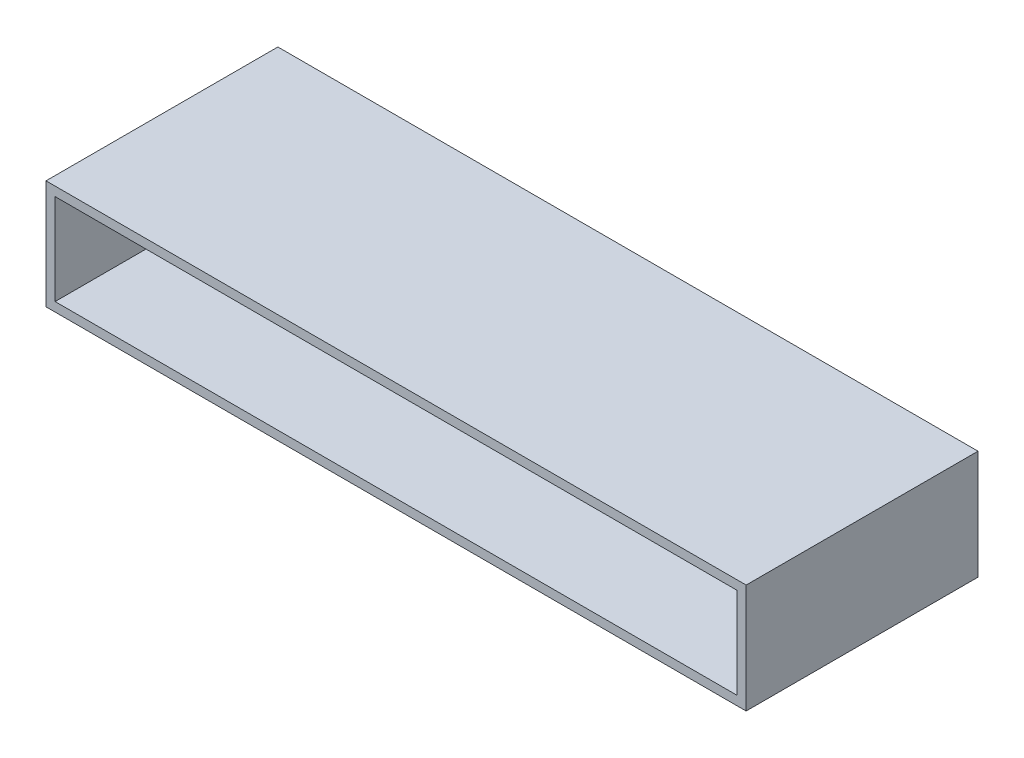
ISO-10303-21;
HEADER;
FILE_DESCRIPTION(('STEP AP214'),'2;1');
FILE_NAME('part.step','',(''),(''),'','','');
FILE_SCHEMA(('AUTOMOTIVE_DESIGN { 1 0 10303 214 1 1 1 1 }'));
ENDSEC;
DATA;
#1=APPLICATION_CONTEXT('core data for automotive mechanical design processes');
#2=APPLICATION_PROTOCOL_DEFINITION('international standard','automotive_design',2000,#1);
#3=PRODUCT_CONTEXT('',#1,'mechanical');
#4=PRODUCT('Part','Part','',(#3));
#5=PRODUCT_RELATED_PRODUCT_CATEGORY('part','',(#4));
#6=PRODUCT_DEFINITION_FORMATION('','',#4);
#7=PRODUCT_DEFINITION_CONTEXT('part definition',#1,'design');
#8=PRODUCT_DEFINITION('design','',#6,#7);
#9=PRODUCT_DEFINITION_SHAPE('','',#8);
#10=(LENGTH_UNIT() NAMED_UNIT(*) SI_UNIT(.MILLI.,.METRE.));
#11=(NAMED_UNIT(*) PLANE_ANGLE_UNIT() SI_UNIT($,.RADIAN.));
#12=(NAMED_UNIT(*) SI_UNIT($,.STERADIAN.) SOLID_ANGLE_UNIT());
#13=UNCERTAINTY_MEASURE_WITH_UNIT(LENGTH_MEASURE(1.E-05),#10,'distance_accuracy_value','');
#14=(GEOMETRIC_REPRESENTATION_CONTEXT(3) GLOBAL_UNCERTAINTY_ASSIGNED_CONTEXT((#13)) GLOBAL_UNIT_ASSIGNED_CONTEXT((#10,
#11,#12)) REPRESENTATION_CONTEXT('',''));
#15=CARTESIAN_POINT('',(0.,0.,0.));
#16=DIRECTION('',(0.,0.,1.));
#17=DIRECTION('',(1.,0.,0.));
#18=AXIS2_PLACEMENT_3D('',#15,#16,#17);
#19=CARTESIAN_POINT('',(0.,0.,51.));
#20=DIRECTION('',(0.,0.,-1.));
#21=DIRECTION('',(-1.,0.,0.));
#22=AXIS2_PLACEMENT_3D('',#19,#20,#21);
#23=PLANE('',#22);
#24=DIRECTION('',(0.,-1.,0.));
#25=VECTOR('',#24,1.);
#26=CARTESIAN_POINT('',(0.,0.,51.));
#27=LINE('',#26,#25);
#28=CARTESIAN_POINT('',(0.,24.,51.));
#29=VERTEX_POINT('',#28);
#30=CARTESIAN_POINT('',(0.,0.,51.));
#31=VERTEX_POINT('',#30);
#32=EDGE_CURVE('E144',#29,#31,#27,.T.);
#33=ORIENTED_EDGE('',*,*,#32,.T.);
#34=DIRECTION('',(1.,0.,0.));
#35=VECTOR('',#34,1.);
#36=CARTESIAN_POINT('',(0.,0.,51.));
#37=LINE('',#36,#35);
#38=CARTESIAN_POINT('',(154.,0.,51.));
#39=VERTEX_POINT('',#38);
#40=EDGE_CURVE('E146',#31,#39,#37,.T.);
#41=ORIENTED_EDGE('',*,*,#40,.T.);
#42=DIRECTION('',(0.,1.,0.));
#43=VECTOR('',#42,1.);
#44=CARTESIAN_POINT('',(154.,0.,51.));
#45=LINE('',#44,#43);
#46=CARTESIAN_POINT('',(154.,24.,51.));
#47=VERTEX_POINT('',#46);
#48=EDGE_CURVE('E151',#39,#47,#45,.T.);
#49=ORIENTED_EDGE('',*,*,#48,.T.);
#50=DIRECTION('',(-1.,0.,0.));
#51=VECTOR('',#50,1.);
#52=CARTESIAN_POINT('',(0.,24.,51.));
#53=LINE('',#52,#51);
#54=EDGE_CURVE('E153',#47,#29,#53,.T.);
#55=ORIENTED_EDGE('',*,*,#54,.T.);
#56=EDGE_LOOP('',(#33,#41,#49,#55));
#57=FACE_BOUND('',#56,.T.);
#58=DIRECTION('',(0.,-1.,0.));
#59=VECTOR('',#58,1.);
#60=CARTESIAN_POINT('',(2.,2.,51.));
#61=LINE('',#60,#59);
#62=CARTESIAN_POINT('',(2.,22.,51.));
#63=VERTEX_POINT('',#62);
#64=CARTESIAN_POINT('',(2.,2.,51.));
#65=VERTEX_POINT('',#64);
#66=EDGE_CURVE('E126',#63,#65,#61,.T.);
#67=ORIENTED_EDGE('',*,*,#66,.F.);
#68=DIRECTION('',(-1.,0.,0.));
#69=VECTOR('',#68,1.);
#70=CARTESIAN_POINT('',(2.,22.,51.));
#71=LINE('',#70,#69);
#72=CARTESIAN_POINT('',(152.,22.,51.));
#73=VERTEX_POINT('',#72);
#74=EDGE_CURVE('E117',#73,#63,#71,.T.);
#75=ORIENTED_EDGE('',*,*,#74,.F.);
#76=DIRECTION('',(0.,1.,0.));
#77=VECTOR('',#76,1.);
#78=CARTESIAN_POINT('',(152.,2.,51.));
#79=LINE('',#78,#77);
#80=CARTESIAN_POINT('',(152.,2.,51.));
#81=VERTEX_POINT('',#80);
#82=EDGE_CURVE('E137',#81,#73,#79,.T.);
#83=ORIENTED_EDGE('',*,*,#82,.F.);
#84=DIRECTION('',(1.,0.,0.));
#85=VECTOR('',#84,1.);
#86=CARTESIAN_POINT('',(2.,2.,51.));
#87=LINE('',#86,#85);
#88=EDGE_CURVE('E128',#65,#81,#87,.T.);
#89=ORIENTED_EDGE('',*,*,#88,.F.);
#90=EDGE_LOOP('',(#67,#75,#83,#89));
#91=FACE_BOUND('',#90,.T.);
#92=ADVANCED_FACE('F43',(#57,#91),#23,.F.);
#93=CARTESIAN_POINT('',(0.,0.,0.));
#94=DIRECTION('',(0.,0.,-1.));
#95=DIRECTION('',(-1.,0.,0.));
#96=AXIS2_PLACEMENT_3D('',#93,#94,#95);
#97=PLANE('',#96);
#98=DIRECTION('',(0.,-1.,0.));
#99=VECTOR('',#98,1.);
#100=CARTESIAN_POINT('',(0.,0.,0.));
#101=LINE('',#100,#99);
#102=CARTESIAN_POINT('',(0.,24.,0.));
#103=VERTEX_POINT('',#102);
#104=CARTESIAN_POINT('',(0.,0.,0.));
#105=VERTEX_POINT('',#104);
#106=EDGE_CURVE('E145',#103,#105,#101,.T.);
#107=ORIENTED_EDGE('',*,*,#106,.F.);
#108=DIRECTION('',(-1.,0.,0.));
#109=VECTOR('',#108,1.);
#110=CARTESIAN_POINT('',(0.,24.,0.));
#111=LINE('',#110,#109);
#112=CARTESIAN_POINT('',(154.,24.,0.));
#113=VERTEX_POINT('',#112);
#114=EDGE_CURVE('E149',#113,#103,#111,.T.);
#115=ORIENTED_EDGE('',*,*,#114,.F.);
#116=DIRECTION('',(0.,1.,0.));
#117=VECTOR('',#116,1.);
#118=CARTESIAN_POINT('',(154.,0.,0.));
#119=LINE('',#118,#117);
#120=CARTESIAN_POINT('',(154.,0.,0.));
#121=VERTEX_POINT('',#120);
#122=EDGE_CURVE('E159',#121,#113,#119,.T.);
#123=ORIENTED_EDGE('',*,*,#122,.F.);
#124=DIRECTION('',(1.,0.,0.));
#125=VECTOR('',#124,1.);
#126=CARTESIAN_POINT('',(0.,0.,0.));
#127=LINE('',#126,#125);
#128=EDGE_CURVE('E158',#105,#121,#127,.T.);
#129=ORIENTED_EDGE('',*,*,#128,.F.);
#130=EDGE_LOOP('',(#107,#115,#123,#129));
#131=FACE_BOUND('',#130,.T.);
#132=ADVANCED_FACE('F180',(#131),#97,.T.);
#133=CARTESIAN_POINT('',(0.,0.,51.));
#134=DIRECTION('',(1.,0.,0.));
#135=DIRECTION('',(0.,0.,-1.));
#136=AXIS2_PLACEMENT_3D('',#133,#134,#135);
#137=PLANE('',#136);
#138=ORIENTED_EDGE('',*,*,#106,.T.);
#139=DIRECTION('',(0.,0.,-1.));
#140=VECTOR('',#139,1.);
#141=CARTESIAN_POINT('',(0.,0.,51.));
#142=LINE('',#141,#140);
#143=EDGE_CURVE('E11',#31,#105,#142,.T.);
#144=ORIENTED_EDGE('',*,*,#143,.F.);
#145=ORIENTED_EDGE('',*,*,#32,.F.);
#146=DIRECTION('',(0.,0.,-1.));
#147=VECTOR('',#146,1.);
#148=CARTESIAN_POINT('',(0.,24.,51.));
#149=LINE('',#148,#147);
#150=EDGE_CURVE('E154',#29,#103,#149,.T.);
#151=ORIENTED_EDGE('',*,*,#150,.T.);
#152=EDGE_LOOP('',(#138,#144,#145,#151));
#153=FACE_BOUND('',#152,.T.);
#154=ADVANCED_FACE('F44',(#153),#137,.F.);
#155=CARTESIAN_POINT('',(0.,0.,51.));
#156=DIRECTION('',(0.,1.,0.));
#157=DIRECTION('',(0.,0.,1.));
#158=AXIS2_PLACEMENT_3D('',#155,#156,#157);
#159=PLANE('',#158);
#160=ORIENTED_EDGE('',*,*,#128,.T.);
#161=DIRECTION('',(0.,0.,-1.));
#162=VECTOR('',#161,1.);
#163=CARTESIAN_POINT('',(154.,0.,51.));
#164=LINE('',#163,#162);
#165=EDGE_CURVE('E51',#39,#121,#164,.T.);
#166=ORIENTED_EDGE('',*,*,#165,.F.);
#167=ORIENTED_EDGE('',*,*,#40,.F.);
#168=ORIENTED_EDGE('',*,*,#143,.T.);
#169=EDGE_LOOP('',(#160,#166,#167,#168));
#170=FACE_BOUND('',#169,.T.);
#171=ADVANCED_FACE('F189',(#170),#159,.F.);
#172=CARTESIAN_POINT('',(154.,0.,51.));
#173=DIRECTION('',(-1.,0.,0.));
#174=DIRECTION('',(0.,0.,1.));
#175=AXIS2_PLACEMENT_3D('',#172,#173,#174);
#176=PLANE('',#175);
#177=ORIENTED_EDGE('',*,*,#122,.T.);
#178=DIRECTION('',(0.,0.,-1.));
#179=VECTOR('',#178,1.);
#180=CARTESIAN_POINT('',(154.,24.,51.));
#181=LINE('',#180,#179);
#182=EDGE_CURVE('E164',#47,#113,#181,.T.);
#183=ORIENTED_EDGE('',*,*,#182,.F.);
#184=ORIENTED_EDGE('',*,*,#48,.F.);
#185=ORIENTED_EDGE('',*,*,#165,.T.);
#186=EDGE_LOOP('',(#177,#183,#184,#185));
#187=FACE_BOUND('',#186,.T.);
#188=ADVANCED_FACE('F175',(#187),#176,.F.);
#189=CARTESIAN_POINT('',(0.,24.,51.));
#190=DIRECTION('',(0.,-1.,0.));
#191=DIRECTION('',(0.,0.,-1.));
#192=AXIS2_PLACEMENT_3D('',#189,#190,#191);
#193=PLANE('',#192);
#194=ORIENTED_EDGE('',*,*,#114,.T.);
#195=ORIENTED_EDGE('',*,*,#150,.F.);
#196=ORIENTED_EDGE('',*,*,#54,.F.);
#197=ORIENTED_EDGE('',*,*,#182,.T.);
#198=EDGE_LOOP('',(#194,#195,#196,#197));
#199=FACE_BOUND('',#198,.T.);
#200=ADVANCED_FACE('F182',(#199),#193,.F.);
#201=CARTESIAN_POINT('',(2.,2.,51.));
#202=DIRECTION('',(1.,0.,0.));
#203=DIRECTION('',(0.,0.,-1.));
#204=AXIS2_PLACEMENT_3D('',#201,#202,#203);
#205=PLANE('',#204);
#206=DIRECTION('',(0.,-1.,0.));
#207=VECTOR('',#206,1.);
#208=CARTESIAN_POINT('',(2.,2.,2.));
#209=LINE('',#208,#207);
#210=CARTESIAN_POINT('',(2.,22.,2.));
#211=VERTEX_POINT('',#210);
#212=CARTESIAN_POINT('',(2.,2.,2.));
#213=VERTEX_POINT('',#212);
#214=EDGE_CURVE('E124',#211,#213,#209,.T.);
#215=ORIENTED_EDGE('',*,*,#214,.F.);
#216=DIRECTION('',(0.,0.,-1.));
#217=VECTOR('',#216,1.);
#218=CARTESIAN_POINT('',(2.,22.,51.));
#219=LINE('',#218,#217);
#220=EDGE_CURVE('E109',#63,#211,#219,.T.);
#221=ORIENTED_EDGE('',*,*,#220,.F.);
#222=ORIENTED_EDGE('',*,*,#66,.T.);
#223=DIRECTION('',(0.,0.,-1.));
#224=VECTOR('',#223,1.);
#225=CARTESIAN_POINT('',(2.,2.,51.));
#226=LINE('',#225,#224);
#227=EDGE_CURVE('E121',#65,#213,#226,.T.);
#228=ORIENTED_EDGE('',*,*,#227,.T.);
#229=EDGE_LOOP('',(#215,#221,#222,#228));
#230=FACE_BOUND('',#229,.T.);
#231=ADVANCED_FACE('F125',(#230),#205,.T.);
#232=CARTESIAN_POINT('',(2.,2.,51.));
#233=DIRECTION('',(0.,1.,0.));
#234=DIRECTION('',(0.,0.,1.));
#235=AXIS2_PLACEMENT_3D('',#232,#233,#234);
#236=PLANE('',#235);
#237=DIRECTION('',(1.,0.,0.));
#238=VECTOR('',#237,1.);
#239=CARTESIAN_POINT('',(2.,2.,2.));
#240=LINE('',#239,#238);
#241=CARTESIAN_POINT('',(152.,2.,2.));
#242=VERTEX_POINT('',#241);
#243=EDGE_CURVE('E59',#213,#242,#240,.T.);
#244=ORIENTED_EDGE('',*,*,#243,.F.);
#245=ORIENTED_EDGE('',*,*,#227,.F.);
#246=ORIENTED_EDGE('',*,*,#88,.T.);
#247=DIRECTION('',(0.,0.,-1.));
#248=VECTOR('',#247,1.);
#249=CARTESIAN_POINT('',(152.,2.,51.));
#250=LINE('',#249,#248);
#251=EDGE_CURVE('E143',#81,#242,#250,.T.);
#252=ORIENTED_EDGE('',*,*,#251,.T.);
#253=EDGE_LOOP('',(#244,#245,#246,#252));
#254=FACE_BOUND('',#253,.T.);
#255=ADVANCED_FACE('F208',(#254),#236,.T.);
#256=CARTESIAN_POINT('',(152.,2.,51.));
#257=DIRECTION('',(-1.,0.,0.));
#258=DIRECTION('',(0.,0.,1.));
#259=AXIS2_PLACEMENT_3D('',#256,#257,#258);
#260=PLANE('',#259);
#261=DIRECTION('',(0.,1.,0.));
#262=VECTOR('',#261,1.);
#263=CARTESIAN_POINT('',(152.,2.,2.));
#264=LINE('',#263,#262);
#265=CARTESIAN_POINT('',(152.,22.,2.));
#266=VERTEX_POINT('',#265);
#267=EDGE_CURVE('E67',#242,#266,#264,.T.);
#268=ORIENTED_EDGE('',*,*,#267,.F.);
#269=ORIENTED_EDGE('',*,*,#251,.F.);
#270=ORIENTED_EDGE('',*,*,#82,.T.);
#271=DIRECTION('',(0.,0.,-1.));
#272=VECTOR('',#271,1.);
#273=CARTESIAN_POINT('',(152.,22.,51.));
#274=LINE('',#273,#272);
#275=EDGE_CURVE('E116',#73,#266,#274,.T.);
#276=ORIENTED_EDGE('',*,*,#275,.T.);
#277=EDGE_LOOP('',(#268,#269,#270,#276));
#278=FACE_BOUND('',#277,.T.);
#279=ADVANCED_FACE('F215',(#278),#260,.T.);
#280=CARTESIAN_POINT('',(2.,22.,51.));
#281=DIRECTION('',(0.,-1.,0.));
#282=DIRECTION('',(0.,0.,-1.));
#283=AXIS2_PLACEMENT_3D('',#280,#281,#282);
#284=PLANE('',#283);
#285=DIRECTION('',(-1.,0.,0.));
#286=VECTOR('',#285,1.);
#287=CARTESIAN_POINT('',(2.,22.,2.));
#288=LINE('',#287,#286);
#289=EDGE_CURVE('E111',#266,#211,#288,.T.);
#290=ORIENTED_EDGE('',*,*,#289,.F.);
#291=ORIENTED_EDGE('',*,*,#275,.F.);
#292=ORIENTED_EDGE('',*,*,#74,.T.);
#293=ORIENTED_EDGE('',*,*,#220,.T.);
#294=EDGE_LOOP('',(#290,#291,#292,#293));
#295=FACE_BOUND('',#294,.T.);
#296=ADVANCED_FACE('F115',(#295),#284,.T.);
#297=CARTESIAN_POINT('',(0.,0.,2.));
#298=DIRECTION('',(0.,0.,-1.));
#299=DIRECTION('',(-1.,0.,0.));
#300=AXIS2_PLACEMENT_3D('',#297,#298,#299);
#301=PLANE('',#300);
#302=ORIENTED_EDGE('',*,*,#214,.T.);
#303=ORIENTED_EDGE('',*,*,#243,.T.);
#304=ORIENTED_EDGE('',*,*,#267,.T.);
#305=ORIENTED_EDGE('',*,*,#289,.T.);
#306=EDGE_LOOP('',(#302,#303,#304,#305));
#307=FACE_BOUND('',#306,.T.);
#308=ADVANCED_FACE('F130',(#307),#301,.F.);
#309=CLOSED_SHELL('',(#92,#132,#154,#171,#188,#200,#231,#255,#279,#296,#308));
#310=MANIFOLD_SOLID_BREP('B2',#309);
#311=ADVANCED_BREP_SHAPE_REPRESENTATION('',(#18,#310),#14);
#312=SHAPE_DEFINITION_REPRESENTATION(#9,#311);
ENDSEC;
END-ISO-10303-21;
